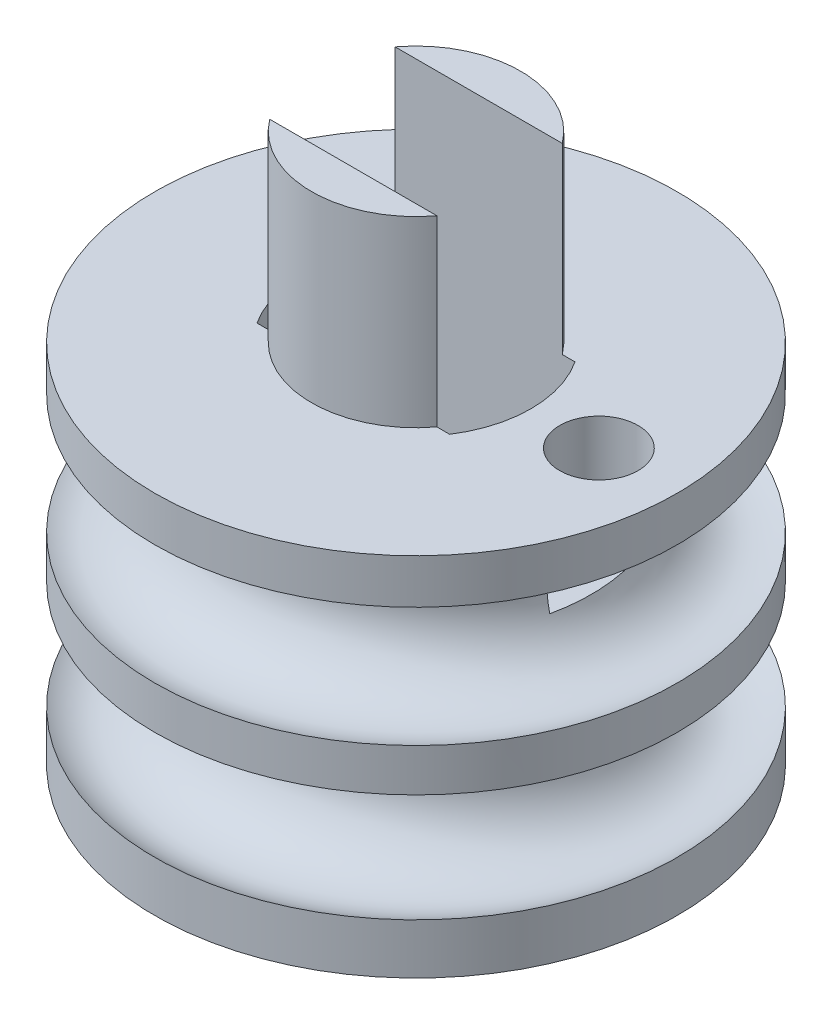
ISO-10303-21;
HEADER;
FILE_DESCRIPTION(('STEP AP214'),'2;1');
FILE_NAME('part.step','',(''),(''),'','','');
FILE_SCHEMA(('AUTOMOTIVE_DESIGN { 1 0 10303 214 1 1 1 1 }'));
ENDSEC;
DATA;
#1=APPLICATION_CONTEXT('core data for automotive mechanical design processes');
#2=APPLICATION_PROTOCOL_DEFINITION('international standard','automotive_design',2000,#1);
#3=PRODUCT_CONTEXT('',#1,'mechanical');
#4=PRODUCT('Part','Part','',(#3));
#5=PRODUCT_RELATED_PRODUCT_CATEGORY('part','',(#4));
#6=PRODUCT_DEFINITION_FORMATION('','',#4);
#7=PRODUCT_DEFINITION_CONTEXT('part definition',#1,'design');
#8=PRODUCT_DEFINITION('design','',#6,#7);
#9=PRODUCT_DEFINITION_SHAPE('','',#8);
#10=(LENGTH_UNIT() NAMED_UNIT(*) SI_UNIT(.MILLI.,.METRE.));
#11=(NAMED_UNIT(*) PLANE_ANGLE_UNIT() SI_UNIT($,.RADIAN.));
#12=(NAMED_UNIT(*) SI_UNIT($,.STERADIAN.) SOLID_ANGLE_UNIT());
#13=UNCERTAINTY_MEASURE_WITH_UNIT(LENGTH_MEASURE(1.E-05),#10,'distance_accuracy_value','');
#14=(GEOMETRIC_REPRESENTATION_CONTEXT(3) GLOBAL_UNCERTAINTY_ASSIGNED_CONTEXT((#13)) GLOBAL_UNIT_ASSIGNED_CONTEXT((#10,
#11,#12)) REPRESENTATION_CONTEXT('',''));
#15=CARTESIAN_POINT('',(0.,0.,0.));
#16=DIRECTION('',(0.,0.,1.));
#17=DIRECTION('',(1.,0.,0.));
#18=AXIS2_PLACEMENT_3D('',#15,#16,#17);
#19=CARTESIAN_POINT('',(0.,-14.1421356237309,0.));
#20=DIRECTION('',(0.,1.,0.));
#21=DIRECTION('',(0.,0.,1.));
#22=AXIS2_PLACEMENT_3D('',#19,#20,#21);
#23=CYLINDRICAL_SURFACE('',#22,5.);
#24=CARTESIAN_POINT('',(0.,1.9643842411396,0.));
#25=DIRECTION('',(0.,1.,0.));
#26=DIRECTION('',(0.,0.,1.));
#27=AXIS2_PLACEMENT_3D('',#24,#25,#26);
#28=CIRCLE('',#27,5.);
#29=CARTESIAN_POINT('',(0.,1.9643842411396,-5.));
#30=VERTEX_POINT('',#29);
#31=EDGE_CURVE('E230',#30,#30,#28,.T.);
#32=ORIENTED_EDGE('',*,*,#31,.F.);
#33=EDGE_LOOP('',(#32));
#34=FACE_BOUND('',#33,.T.);
#35=CARTESIAN_POINT('',(0.,1.,0.));
#36=DIRECTION('',(0.,-1.,0.));
#37=DIRECTION('',(0.,0.,-1.));
#38=AXIS2_PLACEMENT_3D('',#35,#36,#37);
#39=CIRCLE('',#38,5.);
#40=CARTESIAN_POINT('',(0.,1.,-5.));
#41=VERTEX_POINT('',#40);
#42=EDGE_CURVE('E328',#41,#41,#39,.T.);
#43=ORIENTED_EDGE('',*,*,#42,.F.);
#44=EDGE_LOOP('',(#43));
#45=FACE_BOUND('',#44,.T.);
#46=ADVANCED_FACE('F71',(#34,#45),#23,.T.);
#47=CARTESIAN_POINT('',(0.,7.14564392373896,0.));
#48=DIRECTION('',(0.,-1.,0.));
#49=DIRECTION('',(0.,0.,-1.));
#50=AXIS2_PLACEMENT_3D('',#47,#48,#49);
#51=CIRCLE('',#50,5.);
#52=CARTESIAN_POINT('',(0.,7.14564392373896,5.));
#53=VERTEX_POINT('',#52);
#54=EDGE_CURVE('E223',#53,#53,#51,.T.);
#55=ORIENTED_EDGE('',*,*,#54,.F.);
#56=EDGE_LOOP('',(#55));
#57=FACE_BOUND('',#56,.T.);
#58=CARTESIAN_POINT('',(0.,8.,0.));
#59=DIRECTION('',(0.,1.,0.));
#60=DIRECTION('',(0.,0.,1.));
#61=AXIS2_PLACEMENT_3D('',#58,#59,#60);
#62=CIRCLE('',#61,5.);
#63=CARTESIAN_POINT('',(0.,8.,5.));
#64=VERTEX_POINT('',#63);
#65=EDGE_CURVE('E309',#64,#64,#62,.T.);
#66=ORIENTED_EDGE('',*,*,#65,.F.);
#67=EDGE_LOOP('',(#66));
#68=FACE_BOUND('',#67,.T.);
#69=ADVANCED_FACE('F345',(#57,#68),#23,.T.);
#70=CARTESIAN_POINT('',(0.,8.,0.));
#71=DIRECTION('',(0.,1.,0.));
#72=DIRECTION('',(0.,0.,1.));
#73=AXIS2_PLACEMENT_3D('',#70,#71,#72);
#74=PLANE('',#73);
#75=CARTESIAN_POINT('',(3.5,8.,0.));
#76=DIRECTION('',(0.,1.,0.));
#77=DIRECTION('',(0.,0.,1.));
#78=AXIS2_PLACEMENT_3D('',#75,#76,#77);
#79=CIRCLE('',#78,0.75);
#80=CARTESIAN_POINT('',(3.5,8.,0.75));
#81=VERTEX_POINT('',#80);
#82=EDGE_CURVE('E324',#81,#81,#79,.T.);
#83=ORIENTED_EDGE('',*,*,#82,.F.);
#84=EDGE_LOOP('',(#83));
#85=FACE_BOUND('',#84,.T.);
#86=DIRECTION('',(1.,0.,0.));
#87=VECTOR('',#86,1.);
#88=CARTESIAN_POINT('',(0.,8.,1.2));
#89=LINE('',#88,#87);
#90=CARTESIAN_POINT('',(1.6,8.,1.2));
#91=VERTEX_POINT('',#90);
#92=CARTESIAN_POINT('',(1.84390889145858,8.,1.2));
#93=VERTEX_POINT('',#92);
#94=EDGE_CURVE('E270',#91,#93,#89,.T.);
#95=ORIENTED_EDGE('',*,*,#94,.F.);
#96=CARTESIAN_POINT('',(0.,8.,0.));
#97=DIRECTION('',(0.,1.,0.));
#98=DIRECTION('',(0.,0.,1.));
#99=AXIS2_PLACEMENT_3D('',#96,#97,#98);
#100=CIRCLE('',#99,2.);
#101=CARTESIAN_POINT('',(-1.6,8.,1.2));
#102=VERTEX_POINT('',#101);
#103=EDGE_CURVE('E305',#102,#91,#100,.T.);
#104=ORIENTED_EDGE('',*,*,#103,.F.);
#105=CARTESIAN_POINT('',(-1.84390889145858,8.,1.2));
#106=VERTEX_POINT('',#105);
#107=EDGE_CURVE('E266',#106,#102,#89,.T.);
#108=ORIENTED_EDGE('',*,*,#107,.F.);
#109=CARTESIAN_POINT('',(0.,8.,0.));
#110=DIRECTION('',(0.,1.,0.));
#111=DIRECTION('',(0.,0.,1.));
#112=AXIS2_PLACEMENT_3D('',#109,#110,#111);
#113=CIRCLE('',#112,2.2);
#114=CARTESIAN_POINT('',(-1.84390889145858,8.,-1.2));
#115=VERTEX_POINT('',#114);
#116=EDGE_CURVE('E247',#115,#106,#113,.T.);
#117=ORIENTED_EDGE('',*,*,#116,.F.);
#118=DIRECTION('',(1.,0.,0.));
#119=VECTOR('',#118,1.);
#120=CARTESIAN_POINT('',(0.,8.,-1.2));
#121=LINE('',#120,#119);
#122=CARTESIAN_POINT('',(-1.6,8.,-1.2));
#123=VERTEX_POINT('',#122);
#124=EDGE_CURVE('E258',#115,#123,#121,.T.);
#125=ORIENTED_EDGE('',*,*,#124,.T.);
#126=CARTESIAN_POINT('',(0.,8.,0.));
#127=DIRECTION('',(0.,1.,0.));
#128=DIRECTION('',(0.,0.,1.));
#129=AXIS2_PLACEMENT_3D('',#126,#127,#128);
#130=CIRCLE('',#129,2.);
#131=CARTESIAN_POINT('',(1.6,8.,-1.2));
#132=VERTEX_POINT('',#131);
#133=EDGE_CURVE('E288',#132,#123,#130,.T.);
#134=ORIENTED_EDGE('',*,*,#133,.F.);
#135=CARTESIAN_POINT('',(1.84390889145858,8.,-1.2));
#136=VERTEX_POINT('',#135);
#137=EDGE_CURVE('E261',#132,#136,#121,.T.);
#138=ORIENTED_EDGE('',*,*,#137,.T.);
#139=EDGE_CURVE('E262',#93,#136,#113,.T.);
#140=ORIENTED_EDGE('',*,*,#139,.F.);
#141=EDGE_LOOP('',(#95,#104,#108,#117,#125,#134,#138,#140));
#142=FACE_BOUND('',#141,.T.);
#143=ORIENTED_EDGE('',*,*,#65,.T.);
#144=EDGE_LOOP('',(#143));
#145=FACE_BOUND('',#144,.T.);
#146=ADVANCED_FACE('F349',(#85,#142,#145),#74,.T.);
#147=CARTESIAN_POINT('',(0.,-5.01198563445667,1.2));
#148=DIRECTION('',(0.,0.,1.));
#149=DIRECTION('',(1.,0.,0.));
#150=AXIS2_PLACEMENT_3D('',#147,#148,#149);
#151=PLANE('',#150);
#152=DIRECTION('',(-1.,0.,0.));
#153=VECTOR('',#152,1.);
#154=CARTESIAN_POINT('',(0.,1.,1.2));
#155=LINE('',#154,#153);
#156=CARTESIAN_POINT('',(1.84390889145858,1.,1.2));
#157=VERTEX_POINT('',#156);
#158=CARTESIAN_POINT('',(-1.84390889145858,1.,1.2));
#159=VERTEX_POINT('',#158);
#160=EDGE_CURVE('E241',#157,#159,#155,.T.);
#161=ORIENTED_EDGE('',*,*,#160,.T.);
#162=DIRECTION('',(0.,1.,0.));
#163=VECTOR('',#162,1.);
#164=CARTESIAN_POINT('',(-1.84390889145858,-5.01198563445667,1.2));
#165=LINE('',#164,#163);
#166=EDGE_CURVE('E254',#159,#106,#165,.T.);
#167=ORIENTED_EDGE('',*,*,#166,.T.);
#168=ORIENTED_EDGE('',*,*,#107,.T.);
#169=DIRECTION('',(0.,-1.,0.));
#170=VECTOR('',#169,1.);
#171=CARTESIAN_POINT('',(-1.6,11.5,1.2));
#172=LINE('',#171,#170);
#173=CARTESIAN_POINT('',(-1.6,11.5,1.2));
#174=VERTEX_POINT('',#173);
#175=EDGE_CURVE('E293',#174,#102,#172,.T.);
#176=ORIENTED_EDGE('',*,*,#175,.F.);
#177=DIRECTION('',(-1.,0.,0.));
#178=VECTOR('',#177,1.);
#179=CARTESIAN_POINT('',(0.,11.5,1.2));
#180=LINE('',#179,#178);
#181=CARTESIAN_POINT('',(1.6,11.5,1.2));
#182=VERTEX_POINT('',#181);
#183=EDGE_CURVE('E308',#182,#174,#180,.T.);
#184=ORIENTED_EDGE('',*,*,#183,.F.);
#185=DIRECTION('',(0.,-1.,0.));
#186=VECTOR('',#185,1.);
#187=CARTESIAN_POINT('',(1.6,11.5,1.2));
#188=LINE('',#187,#186);
#189=EDGE_CURVE('E301',#182,#91,#188,.T.);
#190=ORIENTED_EDGE('',*,*,#189,.T.);
#191=ORIENTED_EDGE('',*,*,#94,.T.);
#192=DIRECTION('',(0.,1.,0.));
#193=VECTOR('',#192,1.);
#194=CARTESIAN_POINT('',(1.84390889145858,-5.01198563445667,1.2));
#195=LINE('',#194,#193);
#196=EDGE_CURVE('E242',#157,#93,#195,.T.);
#197=ORIENTED_EDGE('',*,*,#196,.F.);
#198=EDGE_LOOP('',(#161,#167,#168,#176,#184,#190,#191,#197));
#199=FACE_BOUND('',#198,.T.);
#200=ADVANCED_FACE('F367',(#199),#151,.F.);
#201=CARTESIAN_POINT('',(0.,-5.01198563445667,0.));
#202=DIRECTION('',(0.,1.,0.));
#203=DIRECTION('',(0.,0.,1.));
#204=AXIS2_PLACEMENT_3D('',#201,#202,#203);
#205=CYLINDRICAL_SURFACE('',#204,2.2);
#206=CARTESIAN_POINT('',(0.,1.,0.));
#207=DIRECTION('',(0.,1.,0.));
#208=DIRECTION('',(0.,0.,1.));
#209=AXIS2_PLACEMENT_3D('',#206,#207,#208);
#210=CIRCLE('',#209,2.2);
#211=CARTESIAN_POINT('',(-1.84390889145858,1.,-1.2));
#212=VERTEX_POINT('',#211);
#213=EDGE_CURVE('E273',#159,#212,#210,.F.);
#214=ORIENTED_EDGE('',*,*,#213,.T.);
#215=DIRECTION('',(0.,1.,0.));
#216=VECTOR('',#215,1.);
#217=CARTESIAN_POINT('',(-1.84390889145858,-5.01198563445667,-1.2));
#218=LINE('',#217,#216);
#219=EDGE_CURVE('E251',#212,#115,#218,.T.);
#220=ORIENTED_EDGE('',*,*,#219,.T.);
#221=ORIENTED_EDGE('',*,*,#116,.T.);
#222=ORIENTED_EDGE('',*,*,#166,.F.);
#223=EDGE_LOOP('',(#214,#220,#221,#222));
#224=FACE_BOUND('',#223,.T.);
#225=ADVANCED_FACE('F371',(#224),#205,.F.);
#226=CARTESIAN_POINT('',(0.,-5.01198563445667,-1.2));
#227=DIRECTION('',(0.,0.,1.));
#228=DIRECTION('',(1.,0.,0.));
#229=AXIS2_PLACEMENT_3D('',#226,#227,#228);
#230=PLANE('',#229);
#231=DIRECTION('',(0.,1.,0.));
#232=VECTOR('',#231,1.);
#233=CARTESIAN_POINT('',(1.84390889145858,-5.01198563445667,-1.2));
#234=LINE('',#233,#232);
#235=CARTESIAN_POINT('',(1.84390889145858,0.999999999999998,-1.2));
#236=VERTEX_POINT('',#235);
#237=EDGE_CURVE('E246',#236,#136,#234,.T.);
#238=ORIENTED_EDGE('',*,*,#237,.T.);
#239=ORIENTED_EDGE('',*,*,#137,.F.);
#240=DIRECTION('',(0.,-1.,0.));
#241=VECTOR('',#240,1.);
#242=CARTESIAN_POINT('',(1.6,11.5,-1.2));
#243=LINE('',#242,#241);
#244=CARTESIAN_POINT('',(1.6,11.5,-1.2));
#245=VERTEX_POINT('',#244);
#246=EDGE_CURVE('E279',#245,#132,#243,.T.);
#247=ORIENTED_EDGE('',*,*,#246,.F.);
#248=DIRECTION('',(1.,0.,0.));
#249=VECTOR('',#248,1.);
#250=CARTESIAN_POINT('',(0.,11.5,-1.2));
#251=LINE('',#250,#249);
#252=CARTESIAN_POINT('',(-1.6,11.5,-1.2));
#253=VERTEX_POINT('',#252);
#254=EDGE_CURVE('E292',#253,#245,#251,.T.);
#255=ORIENTED_EDGE('',*,*,#254,.F.);
#256=DIRECTION('',(0.,-1.,0.));
#257=VECTOR('',#256,1.);
#258=CARTESIAN_POINT('',(-1.6,11.5,-1.2));
#259=LINE('',#258,#257);
#260=EDGE_CURVE('E283',#253,#123,#259,.T.);
#261=ORIENTED_EDGE('',*,*,#260,.T.);
#262=ORIENTED_EDGE('',*,*,#124,.F.);
#263=ORIENTED_EDGE('',*,*,#219,.F.);
#264=DIRECTION('',(-1.,0.,0.));
#265=VECTOR('',#264,1.);
#266=CARTESIAN_POINT('',(0.,1.,-1.2));
#267=LINE('',#266,#265);
#268=EDGE_CURVE('E257',#236,#212,#267,.T.);
#269=ORIENTED_EDGE('',*,*,#268,.F.);
#270=EDGE_LOOP('',(#238,#239,#247,#255,#261,#262,#263,#269));
#271=FACE_BOUND('',#270,.T.);
#272=ADVANCED_FACE('F377',(#271),#230,.T.);
#273=CARTESIAN_POINT('',(0.,1.,0.));
#274=DIRECTION('',(0.,1.,0.));
#275=DIRECTION('',(0.,0.,1.));
#276=AXIS2_PLACEMENT_3D('',#273,#274,#275);
#277=CIRCLE('',#276,2.2);
#278=EDGE_CURVE('E238',#236,#157,#277,.F.);
#279=ORIENTED_EDGE('',*,*,#278,.T.);
#280=ORIENTED_EDGE('',*,*,#196,.T.);
#281=ORIENTED_EDGE('',*,*,#139,.T.);
#282=ORIENTED_EDGE('',*,*,#237,.F.);
#283=EDGE_LOOP('',(#279,#280,#281,#282));
#284=FACE_BOUND('',#283,.T.);
#285=ADVANCED_FACE('F380',(#284),#205,.F.);
#286=CARTESIAN_POINT('',(0.,1.,0.));
#287=DIRECTION('',(0.,1.,0.));
#288=DIRECTION('',(0.,0.,1.));
#289=AXIS2_PLACEMENT_3D('',#286,#287,#288);
#290=PLANE('',#289);
#291=ORIENTED_EDGE('',*,*,#160,.F.);
#292=ORIENTED_EDGE('',*,*,#278,.F.);
#293=ORIENTED_EDGE('',*,*,#268,.T.);
#294=ORIENTED_EDGE('',*,*,#213,.F.);
#295=EDGE_LOOP('',(#291,#292,#293,#294));
#296=FACE_BOUND('',#295,.T.);
#297=ADVANCED_FACE('F385',(#296),#290,.T.);
#298=CARTESIAN_POINT('',(0.,11.5,0.));
#299=DIRECTION('',(0.,-1.,0.));
#300=DIRECTION('',(0.,0.,-1.));
#301=AXIS2_PLACEMENT_3D('',#298,#299,#300);
#302=CYLINDRICAL_SURFACE('',#301,2.);
#303=ORIENTED_EDGE('',*,*,#133,.T.);
#304=ORIENTED_EDGE('',*,*,#260,.F.);
#305=CARTESIAN_POINT('',(0.,11.5,0.));
#306=DIRECTION('',(0.,1.,0.));
#307=DIRECTION('',(0.,0.,1.));
#308=AXIS2_PLACEMENT_3D('',#305,#306,#307);
#309=CIRCLE('',#308,2.);
#310=EDGE_CURVE('E287',#245,#253,#309,.T.);
#311=ORIENTED_EDGE('',*,*,#310,.F.);
#312=ORIENTED_EDGE('',*,*,#246,.T.);
#313=EDGE_LOOP('',(#303,#304,#311,#312));
#314=FACE_BOUND('',#313,.T.);
#315=ADVANCED_FACE('F388',(#314),#302,.T.);
#316=CARTESIAN_POINT('',(0.,11.5,0.));
#317=DIRECTION('',(0.,1.,0.));
#318=DIRECTION('',(0.,0.,1.));
#319=AXIS2_PLACEMENT_3D('',#316,#317,#318);
#320=PLANE('',#319);
#321=ORIENTED_EDGE('',*,*,#254,.T.);
#322=ORIENTED_EDGE('',*,*,#310,.T.);
#323=EDGE_LOOP('',(#321,#322));
#324=FACE_BOUND('',#323,.T.);
#325=ADVANCED_FACE('F392',(#324),#320,.T.);
#326=CARTESIAN_POINT('',(0.,11.5,0.));
#327=DIRECTION('',(0.,-1.,0.));
#328=DIRECTION('',(0.,0.,-1.));
#329=AXIS2_PLACEMENT_3D('',#326,#327,#328);
#330=CYLINDRICAL_SURFACE('',#329,2.);
#331=ORIENTED_EDGE('',*,*,#103,.T.);
#332=ORIENTED_EDGE('',*,*,#189,.F.);
#333=CARTESIAN_POINT('',(0.,11.5,0.));
#334=DIRECTION('',(0.,1.,0.));
#335=DIRECTION('',(0.,0.,1.));
#336=AXIS2_PLACEMENT_3D('',#333,#334,#335);
#337=CIRCLE('',#336,2.);
#338=EDGE_CURVE('E304',#174,#182,#337,.T.);
#339=ORIENTED_EDGE('',*,*,#338,.F.);
#340=ORIENTED_EDGE('',*,*,#175,.T.);
#341=EDGE_LOOP('',(#331,#332,#339,#340));
#342=FACE_BOUND('',#341,.T.);
#343=ADVANCED_FACE('F396',(#342),#330,.T.);
#344=CARTESIAN_POINT('',(0.,11.5,0.));
#345=DIRECTION('',(0.,1.,0.));
#346=DIRECTION('',(0.,0.,1.));
#347=AXIS2_PLACEMENT_3D('',#344,#345,#346);
#348=PLANE('',#347);
#349=ORIENTED_EDGE('',*,*,#183,.T.);
#350=ORIENTED_EDGE('',*,*,#338,.T.);
#351=EDGE_LOOP('',(#349,#350));
#352=FACE_BOUND('',#351,.T.);
#353=ADVANCED_FACE('F399',(#352),#348,.T.);
#354=CARTESIAN_POINT('',(0.,6.,0.));
#355=DIRECTION('',(0.,1.,0.));
#356=DIRECTION('',(0.,0.,1.));
#357=AXIS2_PLACEMENT_3D('',#354,#355,#356);
#358=TOROIDAL_SURFACE('',#357,4.5,1.25);
#359=CARTESIAN_POINT('',(0.,5.5,0.));
#360=DIRECTION('',(0.,-1.,0.));
#361=DIRECTION('',(0.,0.,-1.));
#362=AXIS2_PLACEMENT_3D('',#359,#360,#361);
#363=CIRCLE('',#362,3.35435607626104);
#364=CARTESIAN_POINT('',(3.27702924090705,5.5,0.716089408237207));
#365=VERTEX_POINT('',#364);
#366=CARTESIAN_POINT('',(3.27702924090705,5.5,-0.716089408237207));
#367=VERTEX_POINT('',#366);
#368=EDGE_CURVE('E220',#365,#367,#363,.F.);
#369=ORIENTED_EDGE('',*,*,#368,.F.);
#370=CARTESIAN_POINT('',(3.27711291683034,5.4998,0.716115457280542));
#371=CARTESIAN_POINT('',(3.26494697423708,5.52887261151824,0.712320364191549));
#372=CARTESIAN_POINT('',(3.25391375006921,5.55841952666761,0.708554466008718));
#373=CARTESIAN_POINT('',(3.23410437616178,5.61830131743256,0.701365589289416));
#374=CARTESIAN_POINT('',(3.22532821754985,5.64863618995022,0.697942609404987));
#375=CARTESIAN_POINT('',(3.21002643658406,5.70992579032649,0.691724844889477));
#376=CARTESIAN_POINT('',(3.20350025014679,5.74088036076049,0.688929902866288));
#377=CARTESIAN_POINT('',(3.19269164223001,5.80323462916699,0.684174524834493));
#378=CARTESIAN_POINT('',(3.18840928454437,5.83463433976912,0.682214112552544));
#379=CARTESIAN_POINT('',(3.17825700542734,5.93598736057541,0.67753724538402));
#380=CARTESIAN_POINT('',(3.17675469874872,6.0065380977889,0.676784747336238));
#381=CARTESIAN_POINT('',(3.18476217399557,6.14682973752105,0.680543250909327));
#382=CARTESIAN_POINT('',(3.19427333132388,6.21657053779305,0.685054909938486));
#383=CARTESIAN_POINT('',(3.22400250752458,6.35196969898668,0.697550330553733));
#384=CARTESIAN_POINT('',(3.24401076564868,6.41768081983405,0.705465539779463));
#385=CARTESIAN_POINT('',(3.29472126875993,6.54480136476198,0.721850776010967));
#386=CARTESIAN_POINT('',(3.32541972900139,6.60621230204433,0.730320605799014));
#387=CARTESIAN_POINT('',(3.38912962385501,6.70944633982102,0.742293139317712));
#388=CARTESIAN_POINT('',(3.41997822336055,6.75252235849301,0.746490676027576));
#389=CARTESIAN_POINT('',(3.48755496432295,6.8340018766214,0.750656580176591));
#390=CARTESIAN_POINT('',(3.52427169183938,6.87241419716021,0.750633060224273));
#391=CARTESIAN_POINT('',(3.59510005063052,6.93684794710121,0.744627738103051));
#392=CARTESIAN_POINT('',(3.62841544158636,6.96384333096627,0.739760660072702));
#393=CARTESIAN_POINT('',(3.69696686555139,7.01353164961821,0.724522904444003));
#394=CARTESIAN_POINT('',(3.73220195290609,7.03622667855077,0.714154915022822));
#395=CARTESIAN_POINT('',(3.80310533018022,7.07715800132983,0.687075304752484));
#396=CARTESIAN_POINT('',(3.8387748950719,7.09537199365909,0.670332970659607));
#397=CARTESIAN_POINT('',(3.9084262133925,7.12732944596369,0.63031706050521));
#398=CARTESIAN_POINT('',(3.9424079989653,7.14107299110669,0.607043608885452));
#399=CARTESIAN_POINT('',(4.00409522933802,7.16360450564161,0.556633105368554));
#400=CARTESIAN_POINT('',(4.03208835764731,7.17271294692389,0.529988285900611));
#401=CARTESIAN_POINT('',(4.08393885880978,7.18817308704945,0.472250833361717));
#402=CARTESIAN_POINT('',(4.1077962458731,7.1945247953648,0.441158215573801));
#403=CARTESIAN_POINT('',(4.15060224352333,7.20508081902202,0.375195441992852));
#404=CARTESIAN_POINT('',(4.16952380204155,7.20927341799881,0.340305894791323));
#405=CARTESIAN_POINT('',(4.20166392735614,7.21597980281293,0.267842286929539));
#406=CARTESIAN_POINT('',(4.21488175062983,7.2184933697998,0.230267877021912));
#407=CARTESIAN_POINT('',(4.23551554388899,7.22228016750849,0.152288121384016));
#408=CARTESIAN_POINT('',(4.24274600094006,7.2235140184749,0.111831703067236));
#409=CARTESIAN_POINT('',(4.25050872002347,7.22483488879588,0.0302610075953998));
#410=CARTESIAN_POINT('',(4.25104024492099,7.22492178194194,-0.0108533414584218));
#411=CARTESIAN_POINT('',(4.24534891856374,7.22395898472973,-0.0931648047679939));
#412=CARTESIAN_POINT('',(4.23903389795186,7.2228937851712,-0.134355407718939));
#413=CARTESIAN_POINT('',(4.21969798691505,7.21939747996409,-0.215074539579252));
#414=CARTESIAN_POINT('',(4.20667687205873,7.21696632860125,-0.254603012814593));
#415=CARTESIAN_POINT('',(4.17439697000018,7.21033376688523,-0.330747358112373));
#416=CARTESIAN_POINT('',(4.15515463713279,7.20613701759051,-0.367370599396657));
#417=CARTESIAN_POINT('',(4.11111171523082,7.19539760902223,-0.436724870889618));
#418=CARTESIAN_POINT('',(4.08631217242864,7.18885539118121,-0.469456631957788));
#419=CARTESIAN_POINT('',(4.03272973166613,7.17292783030402,-0.529415714445751));
#420=CARTESIAN_POINT('',(4.00404188690483,7.16360536717337,-0.556744577030444));
#421=CARTESIAN_POINT('',(3.94357039672339,7.14147674450251,-0.606024084731005));
#422=CARTESIAN_POINT('',(3.91178791450158,7.12867189068733,-0.627976739808431));
#423=CARTESIAN_POINT('',(3.84759661530146,7.0995820515278,-0.665598260061548));
#424=CARTESIAN_POINT('',(3.81523291025747,7.08340913327909,-0.681431336909248));
#425=CARTESIAN_POINT('',(3.75049461589327,7.04724821497812,-0.707795919645212));
#426=CARTESIAN_POINT('',(3.71812002644755,7.02726016930837,-0.718327362136363));
#427=CARTESIAN_POINT('',(3.65388401516799,6.98305866204919,-0.734811916712451));
#428=CARTESIAN_POINT('',(3.62205665005072,6.9587505691219,-0.740641623979098));
#429=CARTESIAN_POINT('',(3.56086661569067,6.90665812227389,-0.748162958216173));
#430=CARTESIAN_POINT('',(3.53150560763427,6.87887145627833,-0.749851817409363));
#431=CARTESIAN_POINT('',(3.46364610756629,6.80732196445698,-0.750191185777929));
#432=CARTESIAN_POINT('',(3.4268538353659,6.76193074011773,-0.747166404698704));
#433=CARTESIAN_POINT('',(3.36075430213149,6.66629564413908,-0.737720701758628));
#434=CARTESIAN_POINT('',(3.33146238252163,6.6160421115926,-0.731292900309193));
#435=CARTESIAN_POINT('',(3.27999604609371,6.51076425482521,-0.717512050979799));
#436=CARTESIAN_POINT('',(3.25799186087197,6.45565945774176,-0.710141799329704));
#437=CARTESIAN_POINT('',(3.22195623610078,6.34279020947152,-0.696821604033914));
#438=CARTESIAN_POINT('',(3.20792000561301,6.28502737913337,-0.690870808154626));
#439=CARTESIAN_POINT('',(3.18597531105789,6.15752489737826,-0.681223851178514));
#440=CARTESIAN_POINT('',(3.17958614994965,6.08747115279174,-0.678111207160358));
#441=CARTESIAN_POINT('',(3.17777922166669,5.94714210707253,-0.677256173247293));
#442=CARTESIAN_POINT('',(3.18236844819681,5.87686669320583,-0.679517206609893));
#443=CARTESIAN_POINT('',(3.20014394285697,5.75455566347057,-0.687494580950219));
#444=CARTESIAN_POINT('',(3.21105564499994,5.7021157845166,-0.692273714074106));
#445=CARTESIAN_POINT('',(3.23222484462809,5.62497249753336,-0.700609118844007));
#446=CARTESIAN_POINT('',(3.24007513344394,5.59952621218654,-0.703579823724356));
#447=CARTESIAN_POINT('',(3.25738494695658,5.54920906473897,-0.709733173823687));
#448=CARTESIAN_POINT('',(3.26684471215868,5.52433828926901,-0.712915850674488));
#449=CARTESIAN_POINT('',(3.27711291683033,5.4998,-0.716115457280561));
#450=B_SPLINE_CURVE_WITH_KNOTS('',3,(#370,#371,#372,#373,#374,#375,#376,#377,#378,#379,#380,
#381,#382,#383,#384,#385,#386,#387,#388,#389,#390,#391,#392,#393,#394,#395,#396,#397,#398,#399,
#400,#401,#402,#403,#404,#405,#406,#407,#408,#409,#410,#411,#412,#413,#414,#415,#416,#417,#418,
#419,#420,#421,#422,#423,#424,#425,#426,#427,#428,#429,#430,#431,#432,#433,#434,#435,#436,#437,
#438,#439,#440,#441,#442,#443,#444,#445,#446,#447,#448,#449),.UNSPECIFIED.,.F.,.F.,(4,2,2,2,2,2,
2,2,2,2,2,2,2,2,2,2,2,2,2,2,2,2,2,2,2,2,2,2,2,2,2,2,2,2,2,2,2,2,2,4),(0.,0.0952012025377507,
0.190402030839791,0.285578974257096,0.380758623485525,0.591308978796185,0.801885631263888,
1.00840622647154,1.2148537795989,1.37373175466598,1.53230437941683,1.66123181878637,
1.79009631203869,1.91958973069182,2.04908068218751,2.16763662579284,2.28619216203907,
2.40538443254666,2.52459223592887,2.64736834245448,2.77015795885774,2.8946213512924,
3.01908890938704,3.14322992328379,3.26734758528346,3.38884726777017,3.5103014565176,
3.62822270842298,3.74614537040101,3.86707066436076,3.9880767637833,4.16263156412126,
4.33754060173777,4.51628659246469,4.6949249934055,4.90510100255424,5.11541093850647,
5.27628198072341,5.35661742316736,5.43696488075912),.UNSPECIFIED.);
#451=EDGE_CURVE('E80',#365,#367,#450,.T.);
#452=ORIENTED_EDGE('',*,*,#451,.T.);
#453=EDGE_LOOP('',(#369,#452));
#454=FACE_BOUND('',#453,.T.);
#455=ORIENTED_EDGE('',*,*,#54,.T.);
#456=CARTESIAN_POINT('',(0.,6.,4.5));
#457=DIRECTION('',(1.,0.,0.));
#458=DIRECTION('',(0.,1.,0.));
#459=AXIS2_PLACEMENT_3D('',#456,#457,#458);
#460=CIRCLE('',#459,1.25);
#461=CARTESIAN_POINT('',(0.,4.85435607626104,5.));
#462=VERTEX_POINT('',#461);
#463=EDGE_CURVE('E321',#462,#53,#460,.T.);
#464=ORIENTED_EDGE('',*,*,#463,.F.);
#465=CARTESIAN_POINT('',(0.,4.85435607626104,0.));
#466=DIRECTION('',(0.,1.,0.));
#467=DIRECTION('',(0.,0.,1.));
#468=AXIS2_PLACEMENT_3D('',#465,#466,#467);
#469=CIRCLE('',#468,5.);
#470=EDGE_CURVE('E226',#462,#462,#469,.T.);
#471=ORIENTED_EDGE('',*,*,#470,.T.);
#472=ORIENTED_EDGE('',*,*,#463,.T.);
#473=EDGE_LOOP('',(#455,#464,#471,#472));
#474=FACE_BOUND('',#473,.T.);
#475=ADVANCED_FACE('F211',(#454,#474),#358,.F.);
#476=CARTESIAN_POINT('',(0.,3.,0.));
#477=DIRECTION('',(0.,-1.,0.));
#478=DIRECTION('',(0.,0.,-1.));
#479=AXIS2_PLACEMENT_3D('',#476,#477,#478);
#480=TOROIDAL_SURFACE('',#479,4.3,1.25);
#481=CARTESIAN_POINT('',(0.,3.5,0.));
#482=DIRECTION('',(0.,1.,0.));
#483=DIRECTION('',(0.,0.,1.));
#484=AXIS2_PLACEMENT_3D('',#481,#482,#483);
#485=CIRCLE('',#484,3.15435607626104);
#486=CARTESIAN_POINT('',(-3.09106603654928,3.5,0.628707414889058));
#487=VERTEX_POINT('',#486);
#488=CARTESIAN_POINT('',(-3.09106603654928,3.5,-0.628707414889058));
#489=VERTEX_POINT('',#488);
#490=EDGE_CURVE('E13',#487,#489,#485,.F.);
#491=ORIENTED_EDGE('',*,*,#490,.F.);
#492=CARTESIAN_POINT('',(-3.09114472344763,3.50020000000057,0.628758588677151));
#493=CARTESIAN_POINT('',(-3.0798437130508,3.47146721851476,0.62140921717971));
#494=CARTESIAN_POINT('',(-3.06958018442567,3.44228130905203,0.614304035327519));
#495=CARTESIAN_POINT('',(-3.05110913238931,3.38305223202697,0.600937802184187));
#496=CARTESIAN_POINT('',(-3.0429032384506,3.35300840590641,0.594677421704669));
#497=CARTESIAN_POINT('',(-3.02137985690257,3.26178386913264,0.5777246871598));
#498=CARTESIAN_POINT('',(-3.01113777221088,3.19946171089525,0.568847214167008));
#499=CARTESIAN_POINT('',(-3.00182744232002,3.1024773187804,0.560658856903573));
#500=CARTESIAN_POINT('',(-2.99978689038639,3.06827154252441,0.558826162204811));
#501=CARTESIAN_POINT('',(-2.99816248383646,2.99974572876506,0.557370301609947));
#502=CARTESIAN_POINT('',(-2.99857850716765,2.96542569702304,0.557747025941048));
#503=CARTESIAN_POINT('',(-3.00186320327257,2.89706918090691,0.560681884354917));
#504=CARTESIAN_POINT('',(-3.0047269741663,2.86303226702125,0.563235658632194));
#505=CARTESIAN_POINT('',(-3.01287855362876,2.79544998614412,0.57029912367855));
#506=CARTESIAN_POINT('',(-3.0181674911345,2.76190485559561,0.574809725315733));
#507=CARTESIAN_POINT('',(-3.03627519355361,2.66935135190213,0.58965061490892));
#508=CARTESIAN_POINT('',(-3.0517428101456,2.61112516354158,0.601765156887551));
#509=CARTESIAN_POINT('',(-3.09039567366819,2.49784147720563,0.628711827879314));
#510=CARTESIAN_POINT('',(-3.11360297093773,2.44279356589909,0.643551666350314));
#511=CARTESIAN_POINT('',(-3.17265587123306,2.32769764183771,0.675766785566373));
#512=CARTESIAN_POINT('',(-3.20997498111386,2.26837813283264,0.693146478848226));
#513=CARTESIAN_POINT('',(-3.27425311567968,2.18502112515324,0.715576693916339));
#514=CARTESIAN_POINT('',(-3.29703017739571,2.1582012712283,0.722440825699723));
#515=CARTESIAN_POINT('',(-3.34528749860994,2.1066768825643,0.734289539238923));
#516=CARTESIAN_POINT('',(-3.37076543374779,2.08197056149318,0.739275720591508));
#517=CARTESIAN_POINT('',(-3.42980608384684,2.03008775765402,0.747418313442959));
#518=CARTESIAN_POINT('',(-3.46394864694075,2.0034648476005,0.749979174945053));
#519=CARTESIAN_POINT('',(-3.5350897058246,1.95434271059745,0.750020518956042));
#520=CARTESIAN_POINT('',(-3.57208605977955,1.93184043300323,0.747504776569309));
#521=CARTESIAN_POINT('',(-3.64784963364155,1.89120405329101,0.736283725129016));
#522=CARTESIAN_POINT('',(-3.68662643226345,1.8730979749876,0.727540036578099));
#523=CARTESIAN_POINT('',(-3.76391320938854,1.84147834112706,0.703198944519481));
#524=CARTESIAN_POINT('',(-3.80242322818133,1.8279640766101,0.687602599891157));
#525=CARTESIAN_POINT('',(-3.87365714903351,1.80620981115972,0.651401050443794));
#526=CARTESIAN_POINT('',(-3.90658256235393,1.79758964366976,0.631415627700806));
#527=CARTESIAN_POINT('',(-3.96935571359662,1.78321916528536,0.586259261886782));
#528=CARTESIAN_POINT('',(-3.99920340494576,1.77746889781415,0.561088240362802));
#529=CARTESIAN_POINT('',(-4.05474686125735,1.76819388557,0.506239654946456));
#530=CARTESIAN_POINT('',(-4.08044703792922,1.76466676427342,0.476566945577268));
#531=CARTESIAN_POINT('',(-4.12695393191402,1.75918023947384,0.413479625273095));
#532=CARTESIAN_POINT('',(-4.14775983629531,1.75722109628012,0.380064394069249));
#533=CARTESIAN_POINT('',(-4.1846891569714,1.75424091070943,0.308835149185345));
#534=CARTESIAN_POINT('',(-4.20056913535521,1.75326444773234,0.270892931332848));
#535=CARTESIAN_POINT('',(-4.22592413605045,1.7519091500738,0.19291408330927));
#536=CARTESIAN_POINT('',(-4.2353982333468,1.75153040169236,0.152877151558505));
#537=CARTESIAN_POINT('',(-4.24782693558451,1.75106219762036,0.0708280602909203));
#538=CARTESIAN_POINT('',(-4.25062185050803,1.7509798045807,0.0287915778322184));
#539=CARTESIAN_POINT('',(-4.24914640431409,1.75102864301783,-0.0551578793039774));
#540=CARTESIAN_POINT('',(-4.24487569927,1.75115988489352,-0.0970708478698152));
#541=CARTESIAN_POINT('',(-4.22935957621213,1.75178189461846,-0.17975107583991));
#542=CARTESIAN_POINT('',(-4.21808739208465,1.75227404349771,-0.220513307922123));
#543=CARTESIAN_POINT('',(-4.18886830694123,1.75399772878975,-0.299559437916524));
#544=CARTESIAN_POINT('',(-4.17092106837257,1.75522930259666,-0.337843210379814));
#545=CARTESIAN_POINT('',(-4.12897781903366,1.75900696847217,-0.410663913865385));
#546=CARTESIAN_POINT('',(-4.10500701295551,1.76154762828664,-0.445215620460357));
#547=CARTESIAN_POINT('',(-4.05175830597409,1.76867041636249,-0.50971578937597));
#548=CARTESIAN_POINT('',(-4.02248152616537,1.77325211367244,-0.539665221641645));
#549=CARTESIAN_POINT('',(-3.9605249939094,1.78510093872652,-0.59333936949357));
#550=CARTESIAN_POINT('',(-3.92795576022703,1.79229381489573,-0.6172078024044));
#551=CARTESIAN_POINT('',(-3.86010627854661,1.81006887985982,-0.659098675176806));
#552=CARTESIAN_POINT('',(-3.82482732157656,1.82064946212743,-0.677123877893483));
#553=CARTESIAN_POINT('',(-3.75464726538892,1.84515502606062,-0.706426604158871));
#554=CARTESIAN_POINT('',(-3.71979610761888,1.8589151056865,-0.717962813748413));
#555=CARTESIAN_POINT('',(-3.65041016102758,1.89016211573445,-0.735635246718228));
#556=CARTESIAN_POINT('',(-3.61587537419055,1.90764906951418,-0.741771436253392));
#557=CARTESIAN_POINT('',(-3.54795440459402,1.94646877359078,-0.749255057499497));
#558=CARTESIAN_POINT('',(-3.51458710829782,1.96784538058327,-0.750543815837456));
#559=CARTESIAN_POINT('',(-3.45038341605635,2.01395619371716,-0.749047108057652));
#560=CARTESIAN_POINT('',(-3.41954807782403,2.03869179172479,-0.746259948298462));
#561=CARTESIAN_POINT('',(-3.34792776310935,2.10277318004116,-0.735666672097687));
#562=CARTESIAN_POINT('',(-3.30882361663787,2.14372128609357,-0.726178720713763));
#563=CARTESIAN_POINT('',(-3.23765930579973,2.23053245017918,-0.703619273604306));
#564=CARTESIAN_POINT('',(-3.20562094170139,2.27641008737304,-0.690536959396916));
#565=CARTESIAN_POINT('',(-3.14128371282871,2.38427523024078,-0.659844803596139));
#566=CARTESIAN_POINT('',(-3.11101291536682,2.44738246735927,-0.641932618046894));
#567=CARTESIAN_POINT('',(-3.06116928213427,2.57832740451156,-0.608954136348564));
#568=CARTESIAN_POINT('',(-3.04158241053019,2.64615876547168,-0.593884123462987));
#569=CARTESIAN_POINT('',(-3.02012237491001,2.75044814763039,-0.57645443228133));
#570=CARTESIAN_POINT('',(-3.01428617030268,2.78569231266764,-0.571503406905145));
#571=CARTESIAN_POINT('',(-3.00530134031988,2.85674724419217,-0.563746060382219));
#572=CARTESIAN_POINT('',(-3.00215119314968,2.892557678128,-0.560938524928622));
#573=CARTESIAN_POINT('',(-2.99855871125804,2.96446309844891,-0.557730016491335));
#574=CARTESIAN_POINT('',(-2.99811924159715,3.0005583455493,-0.557331589832785));
#575=CARTESIAN_POINT('',(-2.99995691625297,3.07260849389647,-0.558978680307626));
#576=CARTESIAN_POINT('',(-3.00223375490603,3.10856341047777,-0.561023922457289));
#577=CARTESIAN_POINT('',(-3.0121207074639,3.20589518571673,-0.569693198258848));
#578=CARTESIAN_POINT('',(-3.02239839405384,3.26683415342422,-0.578560008050584));
#579=CARTESIAN_POINT('',(-3.04372317232195,3.3560794804607,-0.595305819926259));
#580=CARTESIAN_POINT('',(-3.05182268965395,3.3854841727781,-0.601466694353425));
#581=CARTESIAN_POINT('',(-3.06999860897418,3.44347080445575,-0.614593406491516));
#582=CARTESIAN_POINT('',(-3.08007370281801,3.47205327397393,-0.621558710295209));
#583=CARTESIAN_POINT('',(-3.0911447234475,3.5002000000005,-0.628758588678106));
#584=B_SPLINE_CURVE_WITH_KNOTS('',3,(#492,#493,#494,#495,#496,#497,#498,#499,#500,#501,#502,
#503,#504,#505,#506,#507,#508,#509,#510,#511,#512,#513,#514,#515,#516,#517,#518,#519,#520,#521,
#522,#523,#524,#525,#526,#527,#528,#529,#530,#531,#532,#533,#534,#535,#536,#537,#538,#539,#540,
#541,#542,#543,#544,#545,#546,#547,#548,#549,#550,#551,#552,#553,#554,#555,#556,#557,#558,#559,
#560,#561,#562,#563,#564,#565,#566,#567,#568,#569,#570,#571,#572,#573,#574,#575,#576,#577,#578,
#579,#580,#581,#582,#583),.UNSPECIFIED.,.F.,.F.,(4,2,2,2,2,2,2,2,2,2,2,2,2,2,2,2,2,2,2,2,2,2,2,
2,2,2,2,2,2,2,2,2,2,2,2,2,2,2,2,2,2,2,2,2,2,4),(0.,0.0951584466335455,0.190392014387447,
0.380699696625937,0.48351297667488,0.586321148591011,0.688923917083307,0.79157449665823,
0.975179504788586,1.15931213667091,1.37458073576733,1.48195811748096,1.5892438295421,
1.71882396133763,1.8483077692393,1.97859649802504,2.10886510154039,2.22670621102854,
2.34454910346625,2.46226580828256,2.58000205189111,2.70286670637224,2.82574909883499,
2.95154127423954,3.0773395728934,3.20362177405231,3.32991036208029,3.45567906693096,
3.58142122913694,3.70383679938586,3.82619440315581,3.94324668345697,4.06029969738854,
4.17876504603554,4.29727963385645,4.4685484607643,4.64033853708594,4.85605458281316,
5.07148654834077,5.17954219949571,5.28753659061018,5.3956451072603,5.50374145970746,
5.69008606819118,5.78336891758071,5.87659020627985),.UNSPECIFIED.);
#585=EDGE_CURVE('E163',#487,#489,#584,.T.);
#586=ORIENTED_EDGE('',*,*,#585,.T.);
#587=EDGE_LOOP('',(#491,#586));
#588=FACE_BOUND('',#587,.T.);
#589=ORIENTED_EDGE('',*,*,#31,.T.);
#590=CARTESIAN_POINT('',(0.,3.,-4.3));
#591=DIRECTION('',(1.,0.,0.));
#592=DIRECTION('',(0.,0.,-1.));
#593=AXIS2_PLACEMENT_3D('',#590,#591,#592);
#594=CIRCLE('',#593,1.25);
#595=CARTESIAN_POINT('',(0.,4.0356157588604,-5.));
#596=VERTEX_POINT('',#595);
#597=EDGE_CURVE('E318',#596,#30,#594,.T.);
#598=ORIENTED_EDGE('',*,*,#597,.F.);
#599=CARTESIAN_POINT('',(0.,4.0356157588604,0.));
#600=DIRECTION('',(0.,-1.,0.));
#601=DIRECTION('',(0.,0.,-1.));
#602=AXIS2_PLACEMENT_3D('',#599,#600,#601);
#603=CIRCLE('',#602,5.);
#604=EDGE_CURVE('E234',#596,#596,#603,.T.);
#605=ORIENTED_EDGE('',*,*,#604,.T.);
#606=ORIENTED_EDGE('',*,*,#597,.T.);
#607=EDGE_LOOP('',(#589,#598,#605,#606));
#608=FACE_BOUND('',#607,.T.);
#609=ADVANCED_FACE('F167',(#588,#608),#480,.F.);
#610=ORIENTED_EDGE('',*,*,#470,.F.);
#611=EDGE_LOOP('',(#610));
#612=FACE_BOUND('',#611,.T.);
#613=ORIENTED_EDGE('',*,*,#604,.F.);
#614=EDGE_LOOP('',(#613));
#615=FACE_BOUND('',#614,.T.);
#616=ADVANCED_FACE('F209',(#612,#615),#23,.T.);
#617=CARTESIAN_POINT('',(3.5,5.5,0.));
#618=DIRECTION('',(0.,1.,0.));
#619=DIRECTION('',(0.,0.,1.));
#620=AXIS2_PLACEMENT_3D('',#617,#618,#619);
#621=CYLINDRICAL_SURFACE('',#620,0.75);
#622=ORIENTED_EDGE('',*,*,#82,.T.);
#623=EDGE_LOOP('',(#622));
#624=FACE_BOUND('',#623,.T.);
#625=CARTESIAN_POINT('',(3.5,5.5,0.));
#626=DIRECTION('',(0.,1.,0.));
#627=DIRECTION('',(0.,0.,1.));
#628=AXIS2_PLACEMENT_3D('',#625,#626,#627);
#629=CIRCLE('',#628,0.75);
#630=EDGE_CURVE('E92',#367,#365,#629,.T.);
#631=ORIENTED_EDGE('',*,*,#630,.F.);
#632=ORIENTED_EDGE('',*,*,#451,.F.);
#633=EDGE_LOOP('',(#631,#632));
#634=FACE_BOUND('',#633,.T.);
#635=ADVANCED_FACE('F206',(#624,#634),#621,.F.);
#636=CARTESIAN_POINT('',(3.5,5.5,0.));
#637=DIRECTION('',(0.,1.,0.));
#638=DIRECTION('',(0.,0.,1.));
#639=AXIS2_PLACEMENT_3D('',#636,#637,#638);
#640=PLANE('',#639);
#641=ORIENTED_EDGE('',*,*,#368,.T.);
#642=ORIENTED_EDGE('',*,*,#630,.T.);
#643=EDGE_LOOP('',(#641,#642));
#644=FACE_BOUND('',#643,.T.);
#645=ADVANCED_FACE('F202',(#644),#640,.T.);
#646=CARTESIAN_POINT('',(0.,1.,0.));
#647=DIRECTION('',(0.,-1.,0.));
#648=DIRECTION('',(0.,0.,-1.));
#649=AXIS2_PLACEMENT_3D('',#646,#647,#648);
#650=CYLINDRICAL_SURFACE('',#649,2.5);
#651=CARTESIAN_POINT('',(0.,1.,0.));
#652=DIRECTION('',(0.,-1.,0.));
#653=DIRECTION('',(0.,0.,-1.));
#654=AXIS2_PLACEMENT_3D('',#651,#652,#653);
#655=CIRCLE('',#654,2.5);
#656=CARTESIAN_POINT('',(0.,1.,-2.5));
#657=VERTEX_POINT('',#656);
#658=EDGE_CURVE('E176',#657,#657,#655,.T.);
#659=ORIENTED_EDGE('',*,*,#658,.T.);
#660=EDGE_LOOP('',(#659));
#661=FACE_BOUND('',#660,.T.);
#662=CARTESIAN_POINT('',(0.,0.,0.));
#663=DIRECTION('',(0.,-1.,0.));
#664=DIRECTION('',(0.,0.,-1.));
#665=AXIS2_PLACEMENT_3D('',#662,#663,#664);
#666=CIRCLE('',#665,2.5);
#667=CARTESIAN_POINT('',(0.,0.,-2.5));
#668=VERTEX_POINT('',#667);
#669=EDGE_CURVE('E170',#668,#668,#666,.T.);
#670=ORIENTED_EDGE('',*,*,#669,.F.);
#671=EDGE_LOOP('',(#670));
#672=FACE_BOUND('',#671,.T.);
#673=ADVANCED_FACE('F198',(#661,#672),#650,.T.);
#674=CARTESIAN_POINT('',(0.,1.,0.));
#675=DIRECTION('',(0.,-1.,0.));
#676=DIRECTION('',(0.,0.,-1.));
#677=AXIS2_PLACEMENT_3D('',#674,#675,#676);
#678=PLANE('',#677);
#679=CARTESIAN_POINT('',(-3.5,1.,0.));
#680=DIRECTION('',(0.,-1.,0.));
#681=DIRECTION('',(0.,0.,-1.));
#682=AXIS2_PLACEMENT_3D('',#679,#680,#681);
#683=CIRCLE('',#682,0.75);
#684=CARTESIAN_POINT('',(-3.5,1.,-0.75));
#685=VERTEX_POINT('',#684);
#686=EDGE_CURVE('E165',#685,#685,#683,.T.);
#687=ORIENTED_EDGE('',*,*,#686,.F.);
#688=EDGE_LOOP('',(#687));
#689=FACE_BOUND('',#688,.T.);
#690=ORIENTED_EDGE('',*,*,#658,.F.);
#691=EDGE_LOOP('',(#690));
#692=FACE_BOUND('',#691,.T.);
#693=ORIENTED_EDGE('',*,*,#42,.T.);
#694=EDGE_LOOP('',(#693));
#695=FACE_BOUND('',#694,.T.);
#696=ADVANCED_FACE('F195',(#689,#692,#695),#678,.T.);
#697=CARTESIAN_POINT('',(0.,0.,0.));
#698=DIRECTION('',(0.,1.,0.));
#699=DIRECTION('',(0.,0.,1.));
#700=AXIS2_PLACEMENT_3D('',#697,#698,#699);
#701=PLANE('',#700);
#702=ORIENTED_EDGE('',*,*,#669,.T.);
#703=EDGE_LOOP('',(#702));
#704=FACE_BOUND('',#703,.T.);
#705=ADVANCED_FACE('F73',(#704),#701,.F.);
#706=CARTESIAN_POINT('',(-3.5,3.5,0.));
#707=DIRECTION('',(0.,-1.,0.));
#708=DIRECTION('',(0.,0.,-1.));
#709=AXIS2_PLACEMENT_3D('',#706,#707,#708);
#710=PLANE('',#709);
#711=ORIENTED_EDGE('',*,*,#490,.T.);
#712=CARTESIAN_POINT('',(-3.5,3.5,0.));
#713=DIRECTION('',(0.,-1.,0.));
#714=DIRECTION('',(0.,0.,-1.));
#715=AXIS2_PLACEMENT_3D('',#712,#713,#714);
#716=CIRCLE('',#715,0.75);
#717=EDGE_CURVE('E85',#489,#487,#716,.T.);
#718=ORIENTED_EDGE('',*,*,#717,.T.);
#719=EDGE_LOOP('',(#711,#718));
#720=FACE_BOUND('',#719,.T.);
#721=ADVANCED_FACE('F158',(#720),#710,.T.);
#722=CARTESIAN_POINT('',(-3.5,3.5,0.));
#723=DIRECTION('',(0.,-1.,0.));
#724=DIRECTION('',(0.,0.,-1.));
#725=AXIS2_PLACEMENT_3D('',#722,#723,#724);
#726=CYLINDRICAL_SURFACE('',#725,0.75);
#727=ORIENTED_EDGE('',*,*,#686,.T.);
#728=EDGE_LOOP('',(#727));
#729=FACE_BOUND('',#728,.T.);
#730=ORIENTED_EDGE('',*,*,#717,.F.);
#731=ORIENTED_EDGE('',*,*,#585,.F.);
#732=EDGE_LOOP('',(#730,#731));
#733=FACE_BOUND('',#732,.T.);
#734=ADVANCED_FACE('F162',(#729,#733),#726,.F.);
#735=CLOSED_SHELL('',(#46,#69,#146,#200,#225,#272,#285,#297,#315,#325,#343,#353,#475,#609,#616,
#635,#645,#673,#696,#705,#721,#734));
#736=MANIFOLD_SOLID_BREP('B2',#735);
#737=ADVANCED_BREP_SHAPE_REPRESENTATION('',(#18,#736),#14);
#738=SHAPE_DEFINITION_REPRESENTATION(#9,#737);
ENDSEC;
END-ISO-10303-21;
